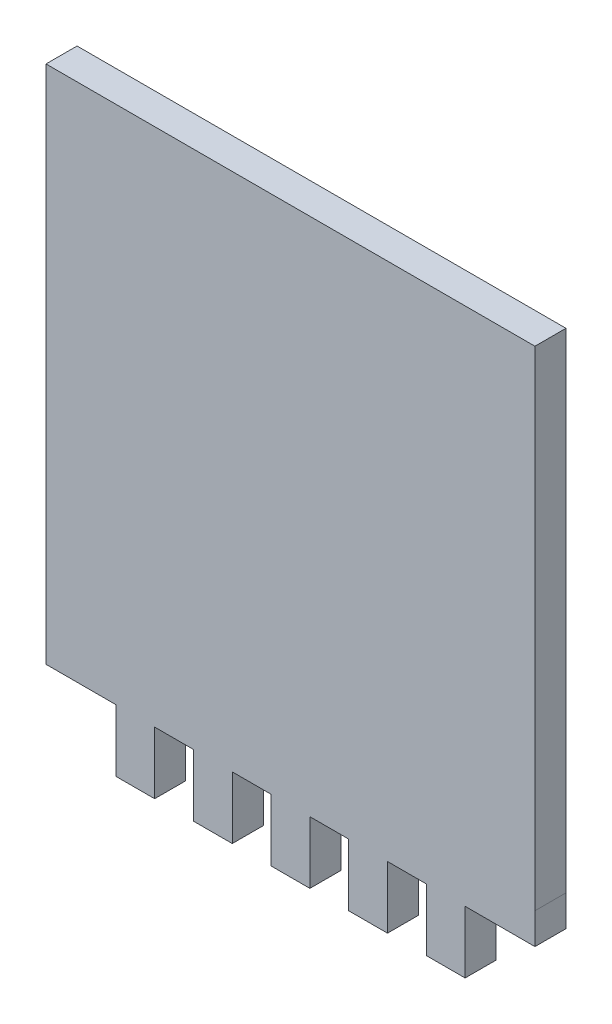
ISO-10303-21;
HEADER;
FILE_DESCRIPTION(('STEP AP214'),'2;1');
FILE_NAME('part.step','',(''),(''),'','','');
FILE_SCHEMA(('AUTOMOTIVE_DESIGN { 1 0 10303 214 1 1 1 1 }'));
ENDSEC;
DATA;
#1=APPLICATION_CONTEXT('core data for automotive mechanical design processes');
#2=APPLICATION_PROTOCOL_DEFINITION('international standard','automotive_design',2000,#1);
#3=PRODUCT_CONTEXT('',#1,'mechanical');
#4=PRODUCT('Part','Part','',(#3));
#5=PRODUCT_RELATED_PRODUCT_CATEGORY('part','',(#4));
#6=PRODUCT_DEFINITION_FORMATION('','',#4);
#7=PRODUCT_DEFINITION_CONTEXT('part definition',#1,'design');
#8=PRODUCT_DEFINITION('design','',#6,#7);
#9=PRODUCT_DEFINITION_SHAPE('','',#8);
#10=(LENGTH_UNIT() NAMED_UNIT(*) SI_UNIT(.MILLI.,.METRE.));
#11=(NAMED_UNIT(*) PLANE_ANGLE_UNIT() SI_UNIT($,.RADIAN.));
#12=(NAMED_UNIT(*) SI_UNIT($,.STERADIAN.) SOLID_ANGLE_UNIT());
#13=UNCERTAINTY_MEASURE_WITH_UNIT(LENGTH_MEASURE(1.E-05),#10,'distance_accuracy_value','');
#14=(GEOMETRIC_REPRESENTATION_CONTEXT(3) GLOBAL_UNCERTAINTY_ASSIGNED_CONTEXT((#13)) GLOBAL_UNIT_ASSIGNED_CONTEXT((#10,
#11,#12)) REPRESENTATION_CONTEXT('',''));
#15=CARTESIAN_POINT('',(0.,0.,0.));
#16=DIRECTION('',(0.,0.,1.));
#17=DIRECTION('',(1.,0.,0.));
#18=AXIS2_PLACEMENT_3D('',#15,#16,#17);
#19=CARTESIAN_POINT('',(26.7289592760181,-10.0852941176471,5.08));
#20=DIRECTION('',(0.,1.,0.));
#21=DIRECTION('',(-1.,0.,0.));
#22=AXIS2_PLACEMENT_3D('',#19,#20,#21);
#23=PLANE('',#22);
#24=DIRECTION('',(0.,0.,1.));
#25=VECTOR('',#24,1.);
#26=CARTESIAN_POINT('',(15.3040392760181,-10.0852941176471,0.));
#27=LINE('',#26,#25);
#28=CARTESIAN_POINT('',(15.3040392760181,-10.0852941176471,0.));
#29=VERTEX_POINT('',#28);
#30=CARTESIAN_POINT('',(15.3040392760181,-10.0852941176471,5.08));
#31=VERTEX_POINT('',#30);
#32=EDGE_CURVE('E271',#29,#31,#27,.T.);
#33=ORIENTED_EDGE('',*,*,#32,.F.);
#34=DIRECTION('',(1.,0.,0.));
#35=VECTOR('',#34,1.);
#36=CARTESIAN_POINT('',(26.7289592760181,-10.0852941176471,0.));
#37=LINE('',#36,#35);
#38=CARTESIAN_POINT('',(26.7289592760181,-10.0852941176471,0.));
#39=VERTEX_POINT('',#38);
#40=EDGE_CURVE('E408',#29,#39,#37,.T.);
#41=ORIENTED_EDGE('',*,*,#40,.T.);
#42=DIRECTION('',(0.,0.,-1.));
#43=VECTOR('',#42,1.);
#44=CARTESIAN_POINT('',(26.7289592760181,-10.0852941176471,5.08));
#45=LINE('',#44,#43);
#46=CARTESIAN_POINT('',(26.7289592760181,-10.0852941176471,5.08));
#47=VERTEX_POINT('',#46);
#48=EDGE_CURVE('E416',#47,#39,#45,.T.);
#49=ORIENTED_EDGE('',*,*,#48,.F.);
#50=DIRECTION('',(1.,0.,0.));
#51=VECTOR('',#50,1.);
#52=CARTESIAN_POINT('',(26.7289592760181,-10.0852941176471,5.08));
#53=LINE('',#52,#51);
#54=EDGE_CURVE('E397',#31,#47,#53,.T.);
#55=ORIENTED_EDGE('',*,*,#54,.F.);
#56=EDGE_LOOP('',(#33,#41,#49,#55));
#57=FACE_BOUND('',#56,.T.);
#58=ADVANCED_FACE('F37',(#57),#23,.F.);
#59=CARTESIAN_POINT('',(2.6040392760181,-10.0852941176471,0.));
#60=VERTEX_POINT('',#59);
#61=CARTESIAN_POINT('',(8.9540392760181,-10.0852941176471,0.));
#62=VERTEX_POINT('',#61);
#63=EDGE_CURVE('E449',#60,#62,#37,.T.);
#64=ORIENTED_EDGE('',*,*,#63,.T.);
#65=DIRECTION('',(0.,0.,1.));
#66=VECTOR('',#65,1.);
#67=CARTESIAN_POINT('',(8.9540392760181,-10.0852941176471,0.));
#68=LINE('',#67,#66);
#69=CARTESIAN_POINT('',(8.9540392760181,-10.0852941176471,5.08));
#70=VERTEX_POINT('',#69);
#71=EDGE_CURVE('E284',#62,#70,#68,.T.);
#72=ORIENTED_EDGE('',*,*,#71,.T.);
#73=CARTESIAN_POINT('',(2.6040392760181,-10.0852941176471,5.08));
#74=VERTEX_POINT('',#73);
#75=EDGE_CURVE('E484',#74,#70,#53,.T.);
#76=ORIENTED_EDGE('',*,*,#75,.F.);
#77=DIRECTION('',(0.,0.,1.));
#78=VECTOR('',#77,1.);
#79=CARTESIAN_POINT('',(2.6040392760181,-10.0852941176471,0.));
#80=LINE('',#79,#78);
#81=EDGE_CURVE('E297',#60,#74,#80,.T.);
#82=ORIENTED_EDGE('',*,*,#81,.F.);
#83=EDGE_LOOP('',(#64,#72,#76,#82));
#84=FACE_BOUND('',#83,.T.);
#85=ADVANCED_FACE('F501',(#84),#23,.F.);
#86=CARTESIAN_POINT('',(-10.0959607239819,-10.0852941176471,0.));
#87=VERTEX_POINT('',#86);
#88=CARTESIAN_POINT('',(-3.7459607239819,-10.0852941176471,0.));
#89=VERTEX_POINT('',#88);
#90=EDGE_CURVE('E450',#87,#89,#37,.T.);
#91=ORIENTED_EDGE('',*,*,#90,.T.);
#92=DIRECTION('',(0.,0.,1.));
#93=VECTOR('',#92,1.);
#94=CARTESIAN_POINT('',(-3.7459607239819,-10.0852941176471,0.));
#95=LINE('',#94,#93);
#96=CARTESIAN_POINT('',(-3.7459607239819,-10.0852941176471,5.08));
#97=VERTEX_POINT('',#96);
#98=EDGE_CURVE('E310',#89,#97,#95,.T.);
#99=ORIENTED_EDGE('',*,*,#98,.T.);
#100=CARTESIAN_POINT('',(-10.0959607239819,-10.0852941176471,5.08));
#101=VERTEX_POINT('',#100);
#102=EDGE_CURVE('E481',#101,#97,#53,.T.);
#103=ORIENTED_EDGE('',*,*,#102,.F.);
#104=DIRECTION('',(0.,0.,1.));
#105=VECTOR('',#104,1.);
#106=CARTESIAN_POINT('',(-10.0959607239819,-10.0852941176471,0.));
#107=LINE('',#106,#105);
#108=EDGE_CURVE('E334',#87,#101,#107,.T.);
#109=ORIENTED_EDGE('',*,*,#108,.F.);
#110=EDGE_LOOP('',(#91,#99,#103,#109));
#111=FACE_BOUND('',#110,.T.);
#112=ADVANCED_FACE('F513',(#111),#23,.F.);
#113=CARTESIAN_POINT('',(-22.7959607239819,-10.0852941176471,0.));
#114=VERTEX_POINT('',#113);
#115=CARTESIAN_POINT('',(-16.4459607239819,-10.0852941176471,0.));
#116=VERTEX_POINT('',#115);
#117=EDGE_CURVE('E454',#114,#116,#37,.T.);
#118=ORIENTED_EDGE('',*,*,#117,.T.);
#119=DIRECTION('',(0.,0.,1.));
#120=VECTOR('',#119,1.);
#121=CARTESIAN_POINT('',(-16.4459607239819,-10.0852941176471,0.));
#122=LINE('',#121,#120);
#123=CARTESIAN_POINT('',(-16.4459607239819,-10.0852941176471,5.08));
#124=VERTEX_POINT('',#123);
#125=EDGE_CURVE('E332',#116,#124,#122,.T.);
#126=ORIENTED_EDGE('',*,*,#125,.T.);
#127=CARTESIAN_POINT('',(-22.7959607239819,-10.0852941176471,5.08));
#128=VERTEX_POINT('',#127);
#129=EDGE_CURVE('E479',#128,#124,#53,.T.);
#130=ORIENTED_EDGE('',*,*,#129,.F.);
#131=DIRECTION('',(0.,0.,1.));
#132=VECTOR('',#131,1.);
#133=CARTESIAN_POINT('',(-22.7959607239819,-10.0852941176471,0.));
#134=LINE('',#133,#132);
#135=EDGE_CURVE('E348',#114,#128,#134,.T.);
#136=ORIENTED_EDGE('',*,*,#135,.F.);
#137=EDGE_LOOP('',(#118,#126,#130,#136));
#138=FACE_BOUND('',#137,.T.);
#139=ADVANCED_FACE('F526',(#138),#23,.F.);
#140=CARTESIAN_POINT('',(-35.4959607239819,-10.0852941176471,0.));
#141=VERTEX_POINT('',#140);
#142=CARTESIAN_POINT('',(-29.1459607239819,-10.0852941176471,0.));
#143=VERTEX_POINT('',#142);
#144=EDGE_CURVE('E412',#141,#143,#37,.T.);
#145=ORIENTED_EDGE('',*,*,#144,.T.);
#146=DIRECTION('',(0.,0.,1.));
#147=VECTOR('',#146,1.);
#148=CARTESIAN_POINT('',(-29.1459607239819,-10.0852941176471,0.));
#149=LINE('',#148,#147);
#150=CARTESIAN_POINT('',(-29.1459607239819,-10.0852941176471,5.08));
#151=VERTEX_POINT('',#150);
#152=EDGE_CURVE('E362',#143,#151,#149,.T.);
#153=ORIENTED_EDGE('',*,*,#152,.T.);
#154=CARTESIAN_POINT('',(-35.4959607239819,-10.0852941176471,5.08));
#155=VERTEX_POINT('',#154);
#156=EDGE_CURVE('E402',#155,#151,#53,.T.);
#157=ORIENTED_EDGE('',*,*,#156,.F.);
#158=DIRECTION('',(0.,0.,1.));
#159=VECTOR('',#158,1.);
#160=CARTESIAN_POINT('',(-35.4959607239819,-10.0852941176471,0.));
#161=LINE('',#160,#159);
#162=EDGE_CURVE('E375',#141,#155,#161,.T.);
#163=ORIENTED_EDGE('',*,*,#162,.F.);
#164=EDGE_LOOP('',(#145,#153,#157,#163));
#165=FACE_BOUND('',#164,.T.);
#166=ADVANCED_FACE('F465',(#165),#23,.F.);
#167=CARTESIAN_POINT('',(-53.2710407239819,-5.00529411764707,5.08));
#168=DIRECTION('',(0.,-1.,0.));
#169=DIRECTION('',(0.,0.,-1.));
#170=AXIS2_PLACEMENT_3D('',#167,#168,#169);
#171=PLANE('',#170);
#172=DIRECTION('',(-1.,0.,0.));
#173=VECTOR('',#172,1.);
#174=CARTESIAN_POINT('',(-53.2710407239819,-5.00529411764707,5.08));
#175=LINE('',#174,#173);
#176=CARTESIAN_POINT('',(-53.2709607239819,-5.00529411764707,5.08));
#177=VERTEX_POINT('',#176);
#178=CARTESIAN_POINT('',(-53.2710407239819,-5.00529411764707,5.08));
#179=VERTEX_POINT('',#178);
#180=EDGE_CURVE('E52',#177,#179,#175,.T.);
#181=ORIENTED_EDGE('',*,*,#180,.F.);
#182=DIRECTION('',(0.,0.,1.));
#183=VECTOR('',#182,1.);
#184=CARTESIAN_POINT('',(-53.2709607239819,-5.00529411764705,0.));
#185=LINE('',#184,#183);
#186=CARTESIAN_POINT('',(-53.2709607239819,-5.00529411764707,0.));
#187=VERTEX_POINT('',#186);
#188=EDGE_CURVE('E56',#187,#177,#185,.T.);
#189=ORIENTED_EDGE('',*,*,#188,.F.);
#190=DIRECTION('',(-1.,0.,0.));
#191=VECTOR('',#190,1.);
#192=CARTESIAN_POINT('',(-53.2710407239819,-5.00529411764707,0.));
#193=LINE('',#192,#191);
#194=CARTESIAN_POINT('',(-53.2710407239819,-5.00529411764707,0.));
#195=VERTEX_POINT('',#194);
#196=EDGE_CURVE('E386',#187,#195,#193,.T.);
#197=ORIENTED_EDGE('',*,*,#196,.T.);
#198=DIRECTION('',(0.,0.,-1.));
#199=VECTOR('',#198,1.);
#200=CARTESIAN_POINT('',(-53.2710407239819,-5.00529411764707,5.08));
#201=LINE('',#200,#199);
#202=EDGE_CURVE('E11',#179,#195,#201,.T.);
#203=ORIENTED_EDGE('',*,*,#202,.F.);
#204=EDGE_LOOP('',(#181,#189,#197,#203));
#205=FACE_BOUND('',#204,.T.);
#206=ADVANCED_FACE('F39',(#205),#171,.F.);
#207=CARTESIAN_POINT('',(-53.2710407239819,-10.0852941176471,5.08));
#208=DIRECTION('',(1.,0.,0.));
#209=DIRECTION('',(0.,0.,-1.));
#210=AXIS2_PLACEMENT_3D('',#207,#208,#209);
#211=PLANE('',#210);
#212=DIRECTION('',(0.,-1.,0.));
#213=VECTOR('',#212,1.);
#214=CARTESIAN_POINT('',(-53.2710407239819,-10.0852941176471,0.));
#215=LINE('',#214,#213);
#216=CARTESIAN_POINT('',(-53.2710407239819,-10.0852941176471,0.));
#217=VERTEX_POINT('',#216);
#218=EDGE_CURVE('E406',#195,#217,#215,.T.);
#219=ORIENTED_EDGE('',*,*,#218,.T.);
#220=DIRECTION('',(0.,0.,-1.));
#221=VECTOR('',#220,1.);
#222=CARTESIAN_POINT('',(-53.2710407239819,-10.0852941176471,5.08));
#223=LINE('',#222,#221);
#224=CARTESIAN_POINT('',(-53.2710407239819,-10.0852941176471,5.08));
#225=VERTEX_POINT('',#224);
#226=EDGE_CURVE('E45',#225,#217,#223,.T.);
#227=ORIENTED_EDGE('',*,*,#226,.F.);
#228=DIRECTION('',(0.,-1.,0.));
#229=VECTOR('',#228,1.);
#230=CARTESIAN_POINT('',(-53.2710407239819,-10.0852941176471,5.08));
#231=LINE('',#230,#229);
#232=EDGE_CURVE('E394',#179,#225,#231,.T.);
#233=ORIENTED_EDGE('',*,*,#232,.F.);
#234=ORIENTED_EDGE('',*,*,#202,.T.);
#235=EDGE_LOOP('',(#219,#227,#233,#234));
#236=FACE_BOUND('',#235,.T.);
#237=ADVANCED_FACE('F433',(#236),#211,.F.);
#238=CARTESIAN_POINT('',(-41.8459607239819,-10.0852941176471,0.));
#239=VERTEX_POINT('',#238);
#240=EDGE_CURVE('E409',#217,#239,#37,.T.);
#241=ORIENTED_EDGE('',*,*,#240,.T.);
#242=DIRECTION('',(0.,0.,1.));
#243=VECTOR('',#242,1.);
#244=CARTESIAN_POINT('',(-41.8459607239819,-10.0852941176471,0.));
#245=LINE('',#244,#243);
#246=CARTESIAN_POINT('',(-41.8459607239819,-10.0852941176471,5.08));
#247=VERTEX_POINT('',#246);
#248=EDGE_CURVE('E389',#239,#247,#245,.T.);
#249=ORIENTED_EDGE('',*,*,#248,.T.);
#250=EDGE_CURVE('E398',#225,#247,#53,.T.);
#251=ORIENTED_EDGE('',*,*,#250,.F.);
#252=ORIENTED_EDGE('',*,*,#226,.T.);
#253=EDGE_LOOP('',(#241,#249,#251,#252));
#254=FACE_BOUND('',#253,.T.);
#255=ADVANCED_FACE('F423',(#254),#23,.F.);
#256=CARTESIAN_POINT('',(26.7289592760181,-5.00529411764705,5.08));
#257=DIRECTION('',(-1.,0.,0.));
#258=DIRECTION('',(0.,-1.,0.));
#259=AXIS2_PLACEMENT_3D('',#256,#257,#258);
#260=PLANE('',#259);
#261=DIRECTION('',(0.,1.,0.));
#262=VECTOR('',#261,1.);
#263=CARTESIAN_POINT('',(26.7289592760181,-5.00529411764705,0.));
#264=LINE('',#263,#262);
#265=CARTESIAN_POINT('',(26.7289592760181,-5.00529411764705,0.));
#266=VERTEX_POINT('',#265);
#267=EDGE_CURVE('E395',#39,#266,#264,.T.);
#268=ORIENTED_EDGE('',*,*,#267,.T.);
#269=DIRECTION('',(0.,0.,-1.));
#270=VECTOR('',#269,1.);
#271=CARTESIAN_POINT('',(26.7289592760181,-5.00529411764705,5.08));
#272=LINE('',#271,#270);
#273=CARTESIAN_POINT('',(26.7289592760181,-5.00529411764705,5.08));
#274=VERTEX_POINT('',#273);
#275=EDGE_CURVE('E404',#274,#266,#272,.T.);
#276=ORIENTED_EDGE('',*,*,#275,.F.);
#277=DIRECTION('',(0.,1.,0.));
#278=VECTOR('',#277,1.);
#279=CARTESIAN_POINT('',(26.7289592760181,-5.00529411764705,5.08));
#280=LINE('',#279,#278);
#281=EDGE_CURVE('E401',#47,#274,#280,.T.);
#282=ORIENTED_EDGE('',*,*,#281,.F.);
#283=ORIENTED_EDGE('',*,*,#48,.T.);
#284=EDGE_LOOP('',(#268,#276,#282,#283));
#285=FACE_BOUND('',#284,.T.);
#286=ADVANCED_FACE('F445',(#285),#260,.F.);
#287=CARTESIAN_POINT('',(0.,0.,5.08));
#288=DIRECTION('',(0.,0.,1.));
#289=DIRECTION('',(1.,0.,0.));
#290=AXIS2_PLACEMENT_3D('',#287,#288,#289);
#291=PLANE('',#290);
#292=DIRECTION('',(0.,-1.,0.));
#293=VECTOR('',#292,1.);
#294=CARTESIAN_POINT('',(-53.2709607239819,74.994705882353,5.08));
#295=LINE('',#294,#293);
#296=CARTESIAN_POINT('',(-53.2709607239819,74.994705882353,5.08));
#297=VERTEX_POINT('',#296);
#298=EDGE_CURVE('E248',#297,#177,#295,.T.);
#299=ORIENTED_EDGE('',*,*,#298,.T.);
#300=ORIENTED_EDGE('',*,*,#180,.T.);
#301=ORIENTED_EDGE('',*,*,#232,.T.);
#302=ORIENTED_EDGE('',*,*,#250,.T.);
#303=DIRECTION('',(0.,-1.,0.));
#304=VECTOR('',#303,1.);
#305=CARTESIAN_POINT('',(-41.8459607239819,0.,5.08));
#306=LINE('',#305,#304);
#307=CARTESIAN_POINT('',(-41.8459607239819,-20.2452941176471,5.08));
#308=VERTEX_POINT('',#307);
#309=EDGE_CURVE('E378',#247,#308,#306,.T.);
#310=ORIENTED_EDGE('',*,*,#309,.T.);
#311=DIRECTION('',(-1.,0.,0.));
#312=VECTOR('',#311,1.);
#313=CARTESIAN_POINT('',(0.,-20.2452941176471,5.08));
#314=LINE('',#313,#312);
#315=CARTESIAN_POINT('',(-35.4959607239819,-20.2452941176471,5.08));
#316=VERTEX_POINT('',#315);
#317=EDGE_CURVE('E370',#316,#308,#314,.T.);
#318=ORIENTED_EDGE('',*,*,#317,.F.);
#319=DIRECTION('',(0.,-1.,0.));
#320=VECTOR('',#319,1.);
#321=CARTESIAN_POINT('',(-35.4959607239819,0.,5.08));
#322=LINE('',#321,#320);
#323=EDGE_CURVE('E359',#155,#316,#322,.T.);
#324=ORIENTED_EDGE('',*,*,#323,.F.);
#325=ORIENTED_EDGE('',*,*,#156,.T.);
#326=DIRECTION('',(0.,-1.,0.));
#327=VECTOR('',#326,1.);
#328=CARTESIAN_POINT('',(-29.1459607239819,0.,5.08));
#329=LINE('',#328,#327);
#330=CARTESIAN_POINT('',(-29.1459607239819,-20.2452941176471,5.08));
#331=VERTEX_POINT('',#330);
#332=EDGE_CURVE('E351',#151,#331,#329,.T.);
#333=ORIENTED_EDGE('',*,*,#332,.T.);
#334=DIRECTION('',(-1.,0.,0.));
#335=VECTOR('',#334,1.);
#336=CARTESIAN_POINT('',(0.,-20.2452941176471,5.08));
#337=LINE('',#336,#335);
#338=CARTESIAN_POINT('',(-22.7959607239819,-20.2452941176471,5.08));
#339=VERTEX_POINT('',#338);
#340=EDGE_CURVE('E343',#339,#331,#337,.T.);
#341=ORIENTED_EDGE('',*,*,#340,.F.);
#342=DIRECTION('',(0.,-1.,0.));
#343=VECTOR('',#342,1.);
#344=CARTESIAN_POINT('',(-22.7959607239819,0.,5.08));
#345=LINE('',#344,#343);
#346=EDGE_CURVE('E331',#128,#339,#345,.T.);
#347=ORIENTED_EDGE('',*,*,#346,.F.);
#348=ORIENTED_EDGE('',*,*,#129,.T.);
#349=DIRECTION('',(0.,-1.,0.));
#350=VECTOR('',#349,1.);
#351=CARTESIAN_POINT('',(-16.4459607239819,0.,5.08));
#352=LINE('',#351,#350);
#353=CARTESIAN_POINT('',(-16.4459607239819,-20.2452941176471,5.08));
#354=VERTEX_POINT('',#353);
#355=EDGE_CURVE('E317',#124,#354,#352,.T.);
#356=ORIENTED_EDGE('',*,*,#355,.T.);
#357=DIRECTION('',(-1.,0.,0.));
#358=VECTOR('',#357,1.);
#359=CARTESIAN_POINT('',(0.,-20.2452941176471,5.08));
#360=LINE('',#359,#358);
#361=CARTESIAN_POINT('',(-10.0959607239819,-20.2452941176471,5.08));
#362=VERTEX_POINT('',#361);
#363=EDGE_CURVE('E307',#362,#354,#360,.T.);
#364=ORIENTED_EDGE('',*,*,#363,.F.);
#365=DIRECTION('',(0.,-1.,0.));
#366=VECTOR('',#365,1.);
#367=CARTESIAN_POINT('',(-10.0959607239819,0.,5.08));
#368=LINE('',#367,#366);
#369=EDGE_CURVE('E325',#101,#362,#368,.T.);
#370=ORIENTED_EDGE('',*,*,#369,.F.);
#371=ORIENTED_EDGE('',*,*,#102,.T.);
#372=DIRECTION('',(0.,-1.,0.));
#373=VECTOR('',#372,1.);
#374=CARTESIAN_POINT('',(-3.74596072398189,0.,5.08));
#375=LINE('',#374,#373);
#376=CARTESIAN_POINT('',(-3.7459607239819,-20.2452941176471,5.08));
#377=VERTEX_POINT('',#376);
#378=EDGE_CURVE('E300',#97,#377,#375,.T.);
#379=ORIENTED_EDGE('',*,*,#378,.T.);
#380=DIRECTION('',(1.,0.,0.));
#381=VECTOR('',#380,1.);
#382=CARTESIAN_POINT('',(0.,-20.2452941176471,5.08));
#383=LINE('',#382,#381);
#384=CARTESIAN_POINT('',(2.60403927601811,-20.2452941176471,5.08));
#385=VERTEX_POINT('',#384);
#386=EDGE_CURVE('E291',#377,#385,#383,.T.);
#387=ORIENTED_EDGE('',*,*,#386,.T.);
#388=DIRECTION('',(0.,-1.,0.));
#389=VECTOR('',#388,1.);
#390=CARTESIAN_POINT('',(2.6040392760181,0.,5.08));
#391=LINE('',#390,#389);
#392=EDGE_CURVE('E281',#74,#385,#391,.T.);
#393=ORIENTED_EDGE('',*,*,#392,.F.);
#394=ORIENTED_EDGE('',*,*,#75,.T.);
#395=DIRECTION('',(0.,-1.,0.));
#396=VECTOR('',#395,1.);
#397=CARTESIAN_POINT('',(8.9540392760181,0.,5.08));
#398=LINE('',#397,#396);
#399=CARTESIAN_POINT('',(8.9540392760181,-20.2452941176471,5.08));
#400=VERTEX_POINT('',#399);
#401=EDGE_CURVE('E274',#70,#400,#398,.T.);
#402=ORIENTED_EDGE('',*,*,#401,.T.);
#403=DIRECTION('',(1.,0.,0.));
#404=VECTOR('',#403,1.);
#405=CARTESIAN_POINT('',(0.,-20.2452941176471,5.08));
#406=LINE('',#405,#404);
#407=CARTESIAN_POINT('',(15.3040392760181,-20.2452941176471,5.08));
#408=VERTEX_POINT('',#407);
#409=EDGE_CURVE('E265',#400,#408,#406,.T.);
#410=ORIENTED_EDGE('',*,*,#409,.T.);
#411=DIRECTION('',(0.,-1.,0.));
#412=VECTOR('',#411,1.);
#413=CARTESIAN_POINT('',(15.3040392760181,0.,5.08));
#414=LINE('',#413,#412);
#415=EDGE_CURVE('E259',#31,#408,#414,.T.);
#416=ORIENTED_EDGE('',*,*,#415,.F.);
#417=ORIENTED_EDGE('',*,*,#54,.T.);
#418=ORIENTED_EDGE('',*,*,#281,.T.);
#419=DIRECTION('',(1.,0.,0.));
#420=VECTOR('',#419,1.);
#421=CARTESIAN_POINT('',(-53.2709607239819,-5.00529411764705,5.08));
#422=LINE('',#421,#420);
#423=CARTESIAN_POINT('',(26.7290392760181,-5.00529411764705,5.08));
#424=VERTEX_POINT('',#423);
#425=EDGE_CURVE('E246',#274,#424,#422,.T.);
#426=ORIENTED_EDGE('',*,*,#425,.T.);
#427=DIRECTION('',(0.,1.,0.));
#428=VECTOR('',#427,1.);
#429=CARTESIAN_POINT('',(26.7290392760181,74.994705882353,5.08));
#430=LINE('',#429,#428);
#431=CARTESIAN_POINT('',(26.7290392760181,74.994705882353,5.08));
#432=VERTEX_POINT('',#431);
#433=EDGE_CURVE('E253',#424,#432,#430,.T.);
#434=ORIENTED_EDGE('',*,*,#433,.T.);
#435=DIRECTION('',(-1.,0.,0.));
#436=VECTOR('',#435,1.);
#437=CARTESIAN_POINT('',(-53.2709607239819,74.994705882353,5.08));
#438=LINE('',#437,#436);
#439=EDGE_CURVE('E225',#432,#297,#438,.T.);
#440=ORIENTED_EDGE('',*,*,#439,.T.);
#441=EDGE_LOOP('',(#299,#300,#301,#302,#310,#318,#324,#325,#333,#341,#347,#348,#356,#364,#370,
#371,#379,#387,#393,#394,#402,#410,#416,#417,#418,#426,#434,#440));
#442=FACE_BOUND('',#441,.T.);
#443=ADVANCED_FACE('F432',(#442),#291,.T.);
#444=CARTESIAN_POINT('',(0.,0.,0.));
#445=DIRECTION('',(0.,0.,1.));
#446=DIRECTION('',(1.,0.,0.));
#447=AXIS2_PLACEMENT_3D('',#444,#445,#446);
#448=PLANE('',#447);
#449=ORIENTED_EDGE('',*,*,#196,.F.);
#450=DIRECTION('',(0.,-1.,0.));
#451=VECTOR('',#450,1.);
#452=CARTESIAN_POINT('',(-53.2709607239819,74.994705882353,0.));
#453=LINE('',#452,#451);
#454=CARTESIAN_POINT('',(-53.2709607239819,74.994705882353,0.));
#455=VERTEX_POINT('',#454);
#456=EDGE_CURVE('E240',#455,#187,#453,.T.);
#457=ORIENTED_EDGE('',*,*,#456,.F.);
#458=DIRECTION('',(-1.,0.,0.));
#459=VECTOR('',#458,1.);
#460=CARTESIAN_POINT('',(-53.2709607239819,74.994705882353,0.));
#461=LINE('',#460,#459);
#462=CARTESIAN_POINT('',(26.7290392760181,74.994705882353,0.));
#463=VERTEX_POINT('',#462);
#464=EDGE_CURVE('E223',#463,#455,#461,.T.);
#465=ORIENTED_EDGE('',*,*,#464,.F.);
#466=DIRECTION('',(0.,1.,0.));
#467=VECTOR('',#466,1.);
#468=CARTESIAN_POINT('',(26.7290392760181,74.994705882353,0.));
#469=LINE('',#468,#467);
#470=CARTESIAN_POINT('',(26.7290392760181,-5.00529411764705,0.));
#471=VERTEX_POINT('',#470);
#472=EDGE_CURVE('E238',#471,#463,#469,.T.);
#473=ORIENTED_EDGE('',*,*,#472,.F.);
#474=DIRECTION('',(1.,0.,0.));
#475=VECTOR('',#474,1.);
#476=CARTESIAN_POINT('',(-53.2709607239819,-5.00529411764705,0.));
#477=LINE('',#476,#475);
#478=EDGE_CURVE('E231',#266,#471,#477,.T.);
#479=ORIENTED_EDGE('',*,*,#478,.F.);
#480=ORIENTED_EDGE('',*,*,#267,.F.);
#481=ORIENTED_EDGE('',*,*,#40,.F.);
#482=DIRECTION('',(0.,-1.,0.));
#483=VECTOR('',#482,1.);
#484=CARTESIAN_POINT('',(15.3040392760181,0.,0.));
#485=LINE('',#484,#483);
#486=CARTESIAN_POINT('',(15.3040392760181,-20.2452941176471,0.));
#487=VERTEX_POINT('',#486);
#488=EDGE_CURVE('E262',#29,#487,#485,.T.);
#489=ORIENTED_EDGE('',*,*,#488,.T.);
#490=DIRECTION('',(1.,0.,0.));
#491=VECTOR('',#490,1.);
#492=CARTESIAN_POINT('',(0.,-20.2452941176471,0.));
#493=LINE('',#492,#491);
#494=CARTESIAN_POINT('',(8.9540392760181,-20.2452941176471,0.));
#495=VERTEX_POINT('',#494);
#496=EDGE_CURVE('E268',#495,#487,#493,.T.);
#497=ORIENTED_EDGE('',*,*,#496,.F.);
#498=DIRECTION('',(0.,-1.,0.));
#499=VECTOR('',#498,1.);
#500=CARTESIAN_POINT('',(8.9540392760181,0.,0.));
#501=LINE('',#500,#499);
#502=EDGE_CURVE('E264',#62,#495,#501,.T.);
#503=ORIENTED_EDGE('',*,*,#502,.F.);
#504=ORIENTED_EDGE('',*,*,#63,.F.);
#505=DIRECTION('',(0.,-1.,0.));
#506=VECTOR('',#505,1.);
#507=CARTESIAN_POINT('',(2.6040392760181,0.,0.));
#508=LINE('',#507,#506);
#509=CARTESIAN_POINT('',(2.60403927601811,-20.2452941176471,0.));
#510=VERTEX_POINT('',#509);
#511=EDGE_CURVE('E288',#60,#510,#508,.T.);
#512=ORIENTED_EDGE('',*,*,#511,.T.);
#513=DIRECTION('',(1.,0.,0.));
#514=VECTOR('',#513,1.);
#515=CARTESIAN_POINT('',(0.,-20.2452941176471,0.));
#516=LINE('',#515,#514);
#517=CARTESIAN_POINT('',(-3.7459607239819,-20.2452941176471,0.));
#518=VERTEX_POINT('',#517);
#519=EDGE_CURVE('E294',#518,#510,#516,.T.);
#520=ORIENTED_EDGE('',*,*,#519,.F.);
#521=DIRECTION('',(0.,-1.,0.));
#522=VECTOR('',#521,1.);
#523=CARTESIAN_POINT('',(-3.74596072398189,0.,0.));
#524=LINE('',#523,#522);
#525=EDGE_CURVE('E290',#89,#518,#524,.T.);
#526=ORIENTED_EDGE('',*,*,#525,.F.);
#527=ORIENTED_EDGE('',*,*,#90,.F.);
#528=DIRECTION('',(0.,-1.,0.));
#529=VECTOR('',#528,1.);
#530=CARTESIAN_POINT('',(-10.0959607239819,0.,0.));
#531=LINE('',#530,#529);
#532=CARTESIAN_POINT('',(-10.0959607239819,-20.2452941176471,0.));
#533=VERTEX_POINT('',#532);
#534=EDGE_CURVE('E316',#87,#533,#531,.T.);
#535=ORIENTED_EDGE('',*,*,#534,.T.);
#536=DIRECTION('',(-1.,0.,0.));
#537=VECTOR('',#536,1.);
#538=CARTESIAN_POINT('',(0.,-20.2452941176471,0.));
#539=LINE('',#538,#537);
#540=CARTESIAN_POINT('',(-16.4459607239819,-20.2452941176471,0.));
#541=VERTEX_POINT('',#540);
#542=EDGE_CURVE('E314',#533,#541,#539,.T.);
#543=ORIENTED_EDGE('',*,*,#542,.T.);
#544=DIRECTION('',(0.,-1.,0.));
#545=VECTOR('',#544,1.);
#546=CARTESIAN_POINT('',(-16.4459607239819,0.,0.));
#547=LINE('',#546,#545);
#548=EDGE_CURVE('E319',#116,#541,#547,.T.);
#549=ORIENTED_EDGE('',*,*,#548,.F.);
#550=ORIENTED_EDGE('',*,*,#117,.F.);
#551=DIRECTION('',(0.,-1.,0.));
#552=VECTOR('',#551,1.);
#553=CARTESIAN_POINT('',(-22.7959607239819,0.,0.));
#554=LINE('',#553,#552);
#555=CARTESIAN_POINT('',(-22.7959607239819,-20.2452941176471,0.));
#556=VERTEX_POINT('',#555);
#557=EDGE_CURVE('E339',#114,#556,#554,.T.);
#558=ORIENTED_EDGE('',*,*,#557,.T.);
#559=DIRECTION('',(-1.,0.,0.));
#560=VECTOR('',#559,1.);
#561=CARTESIAN_POINT('',(0.,-20.2452941176471,0.));
#562=LINE('',#561,#560);
#563=CARTESIAN_POINT('',(-29.1459607239819,-20.2452941176471,0.));
#564=VERTEX_POINT('',#563);
#565=EDGE_CURVE('E346',#556,#564,#562,.T.);
#566=ORIENTED_EDGE('',*,*,#565,.T.);
#567=DIRECTION('',(0.,-1.,0.));
#568=VECTOR('',#567,1.);
#569=CARTESIAN_POINT('',(-29.1459607239819,0.,0.));
#570=LINE('',#569,#568);
#571=EDGE_CURVE('E342',#143,#564,#570,.T.);
#572=ORIENTED_EDGE('',*,*,#571,.F.);
#573=ORIENTED_EDGE('',*,*,#144,.F.);
#574=DIRECTION('',(0.,-1.,0.));
#575=VECTOR('',#574,1.);
#576=CARTESIAN_POINT('',(-35.4959607239819,0.,0.));
#577=LINE('',#576,#575);
#578=CARTESIAN_POINT('',(-35.4959607239819,-20.2452941176471,0.));
#579=VERTEX_POINT('',#578);
#580=EDGE_CURVE('E366',#141,#579,#577,.T.);
#581=ORIENTED_EDGE('',*,*,#580,.T.);
#582=DIRECTION('',(-1.,0.,0.));
#583=VECTOR('',#582,1.);
#584=CARTESIAN_POINT('',(0.,-20.2452941176471,0.));
#585=LINE('',#584,#583);
#586=CARTESIAN_POINT('',(-41.8459607239819,-20.2452941176471,0.));
#587=VERTEX_POINT('',#586);
#588=EDGE_CURVE('E373',#579,#587,#585,.T.);
#589=ORIENTED_EDGE('',*,*,#588,.T.);
#590=DIRECTION('',(0.,-1.,0.));
#591=VECTOR('',#590,1.);
#592=CARTESIAN_POINT('',(-41.8459607239819,0.,0.));
#593=LINE('',#592,#591);
#594=EDGE_CURVE('E369',#239,#587,#593,.T.);
#595=ORIENTED_EDGE('',*,*,#594,.F.);
#596=ORIENTED_EDGE('',*,*,#240,.F.);
#597=ORIENTED_EDGE('',*,*,#218,.F.);
#598=EDGE_LOOP('',(#449,#457,#465,#473,#479,#480,#481,#489,#497,#503,#504,#512,#520,#526,#527,
#535,#543,#549,#550,#558,#566,#572,#573,#581,#589,#595,#596,#597));
#599=FACE_BOUND('',#598,.T.);
#600=ADVANCED_FACE('F236',(#599),#448,.F.);
#601=CARTESIAN_POINT('',(-35.4959607239819,0.,0.));
#602=DIRECTION('',(-1.,0.,0.));
#603=DIRECTION('',(0.,0.,1.));
#604=AXIS2_PLACEMENT_3D('',#601,#602,#603);
#605=PLANE('',#604);
#606=ORIENTED_EDGE('',*,*,#323,.T.);
#607=DIRECTION('',(0.,0.,1.));
#608=VECTOR('',#607,1.);
#609=CARTESIAN_POINT('',(-35.4959607239819,-20.2452941176471,0.));
#610=LINE('',#609,#608);
#611=EDGE_CURVE('E383',#579,#316,#610,.T.);
#612=ORIENTED_EDGE('',*,*,#611,.F.);
#613=ORIENTED_EDGE('',*,*,#580,.F.);
#614=ORIENTED_EDGE('',*,*,#162,.T.);
#615=EDGE_LOOP('',(#606,#612,#613,#614));
#616=FACE_BOUND('',#615,.T.);
#617=ADVANCED_FACE('F613',(#616),#605,.F.);
#618=CARTESIAN_POINT('',(0.,-20.2452941176471,0.));
#619=DIRECTION('',(0.,1.,0.));
#620=DIRECTION('',(0.,0.,1.));
#621=AXIS2_PLACEMENT_3D('',#618,#619,#620);
#622=PLANE('',#621);
#623=ORIENTED_EDGE('',*,*,#317,.T.);
#624=DIRECTION('',(0.,0.,1.));
#625=VECTOR('',#624,1.);
#626=CARTESIAN_POINT('',(-41.8459607239819,-20.2452941176471,0.));
#627=LINE('',#626,#625);
#628=EDGE_CURVE('E387',#587,#308,#627,.T.);
#629=ORIENTED_EDGE('',*,*,#628,.F.);
#630=ORIENTED_EDGE('',*,*,#588,.F.);
#631=ORIENTED_EDGE('',*,*,#611,.T.);
#632=EDGE_LOOP('',(#623,#629,#630,#631));
#633=FACE_BOUND('',#632,.T.);
#634=ADVANCED_FACE('F536',(#633),#622,.F.);
#635=CARTESIAN_POINT('',(-41.8459607239819,0.,0.));
#636=DIRECTION('',(-1.,0.,0.));
#637=DIRECTION('',(0.,-1.,0.));
#638=AXIS2_PLACEMENT_3D('',#635,#636,#637);
#639=PLANE('',#638);
#640=ORIENTED_EDGE('',*,*,#309,.F.);
#641=ORIENTED_EDGE('',*,*,#248,.F.);
#642=ORIENTED_EDGE('',*,*,#594,.T.);
#643=ORIENTED_EDGE('',*,*,#628,.T.);
#644=EDGE_LOOP('',(#640,#641,#642,#643));
#645=FACE_BOUND('',#644,.T.);
#646=ADVANCED_FACE('F430',(#645),#639,.T.);
#647=CARTESIAN_POINT('',(-22.7959607239819,0.,0.));
#648=DIRECTION('',(-1.,0.,0.));
#649=DIRECTION('',(0.,-1.,0.));
#650=AXIS2_PLACEMENT_3D('',#647,#648,#649);
#651=PLANE('',#650);
#652=ORIENTED_EDGE('',*,*,#346,.T.);
#653=DIRECTION('',(0.,0.,1.));
#654=VECTOR('',#653,1.);
#655=CARTESIAN_POINT('',(-22.7959607239819,-20.2452941176471,0.));
#656=LINE('',#655,#654);
#657=EDGE_CURVE('E356',#556,#339,#656,.T.);
#658=ORIENTED_EDGE('',*,*,#657,.F.);
#659=ORIENTED_EDGE('',*,*,#557,.F.);
#660=ORIENTED_EDGE('',*,*,#135,.T.);
#661=EDGE_LOOP('',(#652,#658,#659,#660));
#662=FACE_BOUND('',#661,.T.);
#663=ADVANCED_FACE('F528',(#662),#651,.F.);
#664=CARTESIAN_POINT('',(0.,-20.2452941176471,0.));
#665=DIRECTION('',(0.,1.,0.));
#666=DIRECTION('',(0.,0.,1.));
#667=AXIS2_PLACEMENT_3D('',#664,#665,#666);
#668=PLANE('',#667);
#669=ORIENTED_EDGE('',*,*,#340,.T.);
#670=DIRECTION('',(0.,0.,1.));
#671=VECTOR('',#670,1.);
#672=CARTESIAN_POINT('',(-29.1459607239819,-20.2452941176471,0.));
#673=LINE('',#672,#671);
#674=EDGE_CURVE('E360',#564,#331,#673,.T.);
#675=ORIENTED_EDGE('',*,*,#674,.F.);
#676=ORIENTED_EDGE('',*,*,#565,.F.);
#677=ORIENTED_EDGE('',*,*,#657,.T.);
#678=EDGE_LOOP('',(#669,#675,#676,#677));
#679=FACE_BOUND('',#678,.T.);
#680=ADVANCED_FACE('F476',(#679),#668,.F.);
#681=CARTESIAN_POINT('',(-29.1459607239819,0.,0.));
#682=DIRECTION('',(-1.,0.,0.));
#683=DIRECTION('',(0.,-1.,0.));
#684=AXIS2_PLACEMENT_3D('',#681,#682,#683);
#685=PLANE('',#684);
#686=ORIENTED_EDGE('',*,*,#332,.F.);
#687=ORIENTED_EDGE('',*,*,#152,.F.);
#688=ORIENTED_EDGE('',*,*,#571,.T.);
#689=ORIENTED_EDGE('',*,*,#674,.T.);
#690=EDGE_LOOP('',(#686,#687,#688,#689));
#691=FACE_BOUND('',#690,.T.);
#692=ADVANCED_FACE('F471',(#691),#685,.T.);
#693=CARTESIAN_POINT('',(0.,-20.2452941176471,0.));
#694=DIRECTION('',(0.,1.,0.));
#695=DIRECTION('',(0.,0.,1.));
#696=AXIS2_PLACEMENT_3D('',#693,#694,#695);
#697=PLANE('',#696);
#698=ORIENTED_EDGE('',*,*,#363,.T.);
#699=DIRECTION('',(0.,0.,1.));
#700=VECTOR('',#699,1.);
#701=CARTESIAN_POINT('',(-16.4459607239819,-20.2452941176471,0.));
#702=LINE('',#701,#700);
#703=EDGE_CURVE('E329',#541,#354,#702,.T.);
#704=ORIENTED_EDGE('',*,*,#703,.F.);
#705=ORIENTED_EDGE('',*,*,#542,.F.);
#706=DIRECTION('',(0.,0.,1.));
#707=VECTOR('',#706,1.);
#708=CARTESIAN_POINT('',(-10.0959607239819,-20.2452941176471,0.));
#709=LINE('',#708,#707);
#710=EDGE_CURVE('E322',#533,#362,#709,.T.);
#711=ORIENTED_EDGE('',*,*,#710,.T.);
#712=EDGE_LOOP('',(#698,#704,#705,#711));
#713=FACE_BOUND('',#712,.T.);
#714=ADVANCED_FACE('F521',(#713),#697,.F.);
#715=CARTESIAN_POINT('',(-16.4459607239819,0.,0.));
#716=DIRECTION('',(-1.,0.,0.));
#717=DIRECTION('',(0.,0.,1.));
#718=AXIS2_PLACEMENT_3D('',#715,#716,#717);
#719=PLANE('',#718);
#720=ORIENTED_EDGE('',*,*,#355,.F.);
#721=ORIENTED_EDGE('',*,*,#125,.F.);
#722=ORIENTED_EDGE('',*,*,#548,.T.);
#723=ORIENTED_EDGE('',*,*,#703,.T.);
#724=EDGE_LOOP('',(#720,#721,#722,#723));
#725=FACE_BOUND('',#724,.T.);
#726=ADVANCED_FACE('F525',(#725),#719,.T.);
#727=CARTESIAN_POINT('',(-10.0959607239819,0.,0.));
#728=DIRECTION('',(-1.,0.,0.));
#729=DIRECTION('',(0.,-1.,0.));
#730=AXIS2_PLACEMENT_3D('',#727,#728,#729);
#731=PLANE('',#730);
#732=ORIENTED_EDGE('',*,*,#369,.T.);
#733=ORIENTED_EDGE('',*,*,#710,.F.);
#734=ORIENTED_EDGE('',*,*,#534,.F.);
#735=ORIENTED_EDGE('',*,*,#108,.T.);
#736=EDGE_LOOP('',(#732,#733,#734,#735));
#737=FACE_BOUND('',#736,.T.);
#738=ADVANCED_FACE('F516',(#737),#731,.F.);
#739=CARTESIAN_POINT('',(2.6040392760181,0.,0.));
#740=DIRECTION('',(-1.,0.,0.));
#741=DIRECTION('',(0.,-1.,0.));
#742=AXIS2_PLACEMENT_3D('',#739,#740,#741);
#743=PLANE('',#742);
#744=ORIENTED_EDGE('',*,*,#392,.T.);
#745=DIRECTION('',(0.,0.,1.));
#746=VECTOR('',#745,1.);
#747=CARTESIAN_POINT('',(2.60403927601811,-20.2452941176471,0.));
#748=LINE('',#747,#746);
#749=EDGE_CURVE('E305',#510,#385,#748,.T.);
#750=ORIENTED_EDGE('',*,*,#749,.F.);
#751=ORIENTED_EDGE('',*,*,#511,.F.);
#752=ORIENTED_EDGE('',*,*,#81,.T.);
#753=EDGE_LOOP('',(#744,#750,#751,#752));
#754=FACE_BOUND('',#753,.T.);
#755=ADVANCED_FACE('F504',(#754),#743,.F.);
#756=CARTESIAN_POINT('',(0.,-20.2452941176471,0.));
#757=DIRECTION('',(0.,-1.,0.));
#758=DIRECTION('',(0.,0.,-1.));
#759=AXIS2_PLACEMENT_3D('',#756,#757,#758);
#760=PLANE('',#759);
#761=ORIENTED_EDGE('',*,*,#386,.F.);
#762=DIRECTION('',(0.,0.,1.));
#763=VECTOR('',#762,1.);
#764=CARTESIAN_POINT('',(-3.7459607239819,-20.2452941176471,0.));
#765=LINE('',#764,#763);
#766=EDGE_CURVE('E308',#518,#377,#765,.T.);
#767=ORIENTED_EDGE('',*,*,#766,.F.);
#768=ORIENTED_EDGE('',*,*,#519,.T.);
#769=ORIENTED_EDGE('',*,*,#749,.T.);
#770=EDGE_LOOP('',(#761,#767,#768,#769));
#771=FACE_BOUND('',#770,.T.);
#772=ADVANCED_FACE('F508',(#771),#760,.T.);
#773=CARTESIAN_POINT('',(-3.74596072398189,0.,0.));
#774=DIRECTION('',(-1.,0.,0.));
#775=DIRECTION('',(0.,-1.,0.));
#776=AXIS2_PLACEMENT_3D('',#773,#774,#775);
#777=PLANE('',#776);
#778=ORIENTED_EDGE('',*,*,#378,.F.);
#779=ORIENTED_EDGE('',*,*,#98,.F.);
#780=ORIENTED_EDGE('',*,*,#525,.T.);
#781=ORIENTED_EDGE('',*,*,#766,.T.);
#782=EDGE_LOOP('',(#778,#779,#780,#781));
#783=FACE_BOUND('',#782,.T.);
#784=ADVANCED_FACE('F512',(#783),#777,.T.);
#785=CARTESIAN_POINT('',(15.3040392760181,0.,0.));
#786=DIRECTION('',(-1.,0.,0.));
#787=DIRECTION('',(0.,-1.,0.));
#788=AXIS2_PLACEMENT_3D('',#785,#786,#787);
#789=PLANE('',#788);
#790=ORIENTED_EDGE('',*,*,#415,.T.);
#791=DIRECTION('',(0.,0.,1.));
#792=VECTOR('',#791,1.);
#793=CARTESIAN_POINT('',(15.3040392760181,-20.2452941176471,0.));
#794=LINE('',#793,#792);
#795=EDGE_CURVE('E279',#487,#408,#794,.T.);
#796=ORIENTED_EDGE('',*,*,#795,.F.);
#797=ORIENTED_EDGE('',*,*,#488,.F.);
#798=ORIENTED_EDGE('',*,*,#32,.T.);
#799=EDGE_LOOP('',(#790,#796,#797,#798));
#800=FACE_BOUND('',#799,.T.);
#801=ADVANCED_FACE('F494',(#800),#789,.F.);
#802=CARTESIAN_POINT('',(0.,-20.2452941176471,0.));
#803=DIRECTION('',(0.,-1.,0.));
#804=DIRECTION('',(0.,0.,-1.));
#805=AXIS2_PLACEMENT_3D('',#802,#803,#804);
#806=PLANE('',#805);
#807=ORIENTED_EDGE('',*,*,#409,.F.);
#808=DIRECTION('',(0.,0.,1.));
#809=VECTOR('',#808,1.);
#810=CARTESIAN_POINT('',(8.9540392760181,-20.2452941176471,0.));
#811=LINE('',#810,#809);
#812=EDGE_CURVE('E282',#495,#400,#811,.T.);
#813=ORIENTED_EDGE('',*,*,#812,.F.);
#814=ORIENTED_EDGE('',*,*,#496,.T.);
#815=ORIENTED_EDGE('',*,*,#795,.T.);
#816=EDGE_LOOP('',(#807,#813,#814,#815));
#817=FACE_BOUND('',#816,.T.);
#818=ADVANCED_FACE('F498',(#817),#806,.T.);
#819=CARTESIAN_POINT('',(8.9540392760181,0.,0.));
#820=DIRECTION('',(-1.,0.,0.));
#821=DIRECTION('',(0.,-1.,0.));
#822=AXIS2_PLACEMENT_3D('',#819,#820,#821);
#823=PLANE('',#822);
#824=ORIENTED_EDGE('',*,*,#401,.F.);
#825=ORIENTED_EDGE('',*,*,#71,.F.);
#826=ORIENTED_EDGE('',*,*,#502,.T.);
#827=ORIENTED_EDGE('',*,*,#812,.T.);
#828=EDGE_LOOP('',(#824,#825,#826,#827));
#829=FACE_BOUND('',#828,.T.);
#830=ADVANCED_FACE('F500',(#829),#823,.T.);
#831=CARTESIAN_POINT('',(-53.2709607239819,-5.00529411764705,0.));
#832=DIRECTION('',(0.,-1.,0.));
#833=DIRECTION('',(0.,0.,-1.));
#834=AXIS2_PLACEMENT_3D('',#831,#832,#833);
#835=PLANE('',#834);
#836=ORIENTED_EDGE('',*,*,#275,.T.);
#837=ORIENTED_EDGE('',*,*,#478,.T.);
#838=DIRECTION('',(0.,0.,1.));
#839=VECTOR('',#838,1.);
#840=CARTESIAN_POINT('',(26.7290392760181,-5.00529411764705,0.));
#841=LINE('',#840,#839);
#842=EDGE_CURVE('E245',#471,#424,#841,.T.);
#843=ORIENTED_EDGE('',*,*,#842,.T.);
#844=ORIENTED_EDGE('',*,*,#425,.F.);
#845=EDGE_LOOP('',(#836,#837,#843,#844));
#846=FACE_BOUND('',#845,.T.);
#847=ADVANCED_FACE('F441',(#846),#835,.T.);
#848=CARTESIAN_POINT('',(26.7290392760181,74.994705882353,0.));
#849=DIRECTION('',(1.,0.,0.));
#850=DIRECTION('',(0.,1.,0.));
#851=AXIS2_PLACEMENT_3D('',#848,#849,#850);
#852=PLANE('',#851);
#853=ORIENTED_EDGE('',*,*,#433,.F.);
#854=ORIENTED_EDGE('',*,*,#842,.F.);
#855=ORIENTED_EDGE('',*,*,#472,.T.);
#856=DIRECTION('',(0.,0.,1.));
#857=VECTOR('',#856,1.);
#858=CARTESIAN_POINT('',(26.7290392760181,74.994705882353,0.));
#859=LINE('',#858,#857);
#860=EDGE_CURVE('E220',#463,#432,#859,.T.);
#861=ORIENTED_EDGE('',*,*,#860,.T.);
#862=EDGE_LOOP('',(#853,#854,#855,#861));
#863=FACE_BOUND('',#862,.T.);
#864=ADVANCED_FACE('F243',(#863),#852,.T.);
#865=CARTESIAN_POINT('',(-53.2709607239819,74.994705882353,0.));
#866=DIRECTION('',(-1.,0.,0.));
#867=DIRECTION('',(0.,-1.,0.));
#868=AXIS2_PLACEMENT_3D('',#865,#866,#867);
#869=PLANE('',#868);
#870=ORIENTED_EDGE('',*,*,#298,.F.);
#871=DIRECTION('',(0.,0.,1.));
#872=VECTOR('',#871,1.);
#873=CARTESIAN_POINT('',(-53.2709607239819,74.994705882353,0.));
#874=LINE('',#873,#872);
#875=EDGE_CURVE('E230',#455,#297,#874,.T.);
#876=ORIENTED_EDGE('',*,*,#875,.F.);
#877=ORIENTED_EDGE('',*,*,#456,.T.);
#878=ORIENTED_EDGE('',*,*,#188,.T.);
#879=EDGE_LOOP('',(#870,#876,#877,#878));
#880=FACE_BOUND('',#879,.T.);
#881=ADVANCED_FACE('F436',(#880),#869,.T.);
#882=CARTESIAN_POINT('',(-53.2709607239819,74.994705882353,0.));
#883=DIRECTION('',(0.,1.,0.));
#884=DIRECTION('',(0.,0.,1.));
#885=AXIS2_PLACEMENT_3D('',#882,#883,#884);
#886=PLANE('',#885);
#887=ORIENTED_EDGE('',*,*,#439,.F.);
#888=ORIENTED_EDGE('',*,*,#860,.F.);
#889=ORIENTED_EDGE('',*,*,#464,.T.);
#890=ORIENTED_EDGE('',*,*,#875,.T.);
#891=EDGE_LOOP('',(#887,#888,#889,#890));
#892=FACE_BOUND('',#891,.T.);
#893=ADVANCED_FACE('F222',(#892),#886,.T.);
#894=CLOSED_SHELL('',(#58,#85,#112,#139,#166,#206,#237,#255,#286,#443,#600,#617,#634,#646,#663,
#680,#692,#714,#726,#738,#755,#772,#784,#801,#818,#830,#847,#864,#881,#893));
#895=MANIFOLD_SOLID_BREP('B2',#894);
#896=ADVANCED_BREP_SHAPE_REPRESENTATION('',(#18,#895),#14);
#897=SHAPE_DEFINITION_REPRESENTATION(#9,#896);
ENDSEC;
END-ISO-10303-21;
